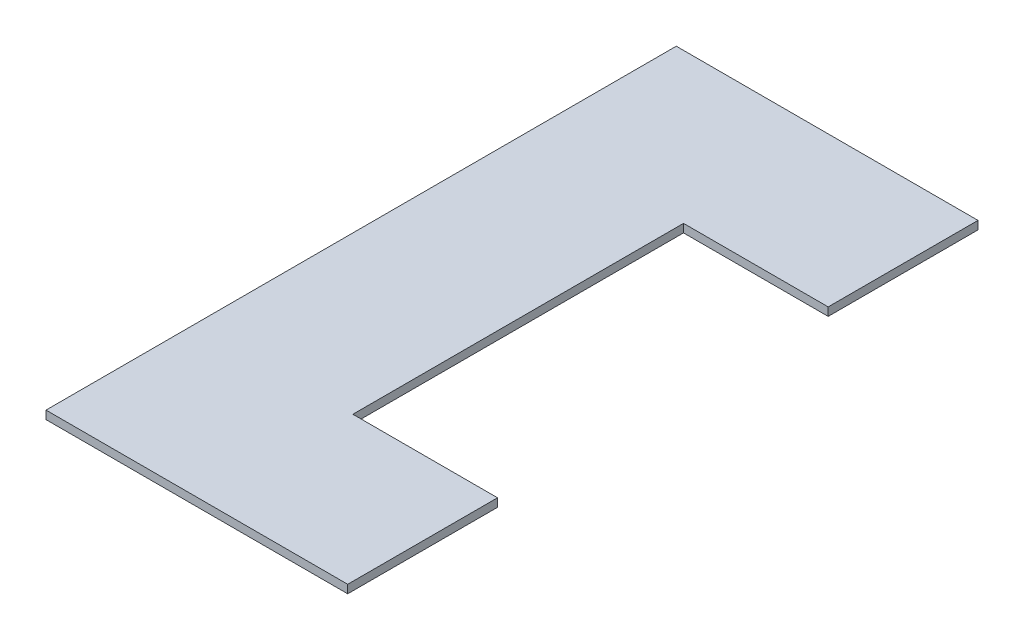
ISO-10303-21;
HEADER;
FILE_DESCRIPTION(('STEP AP214'),'2;1');
FILE_NAME('part.step','',(''),(''),'','','');
FILE_SCHEMA(('AUTOMOTIVE_DESIGN { 1 0 10303 214 1 1 1 1 }'));
ENDSEC;
DATA;
#1=APPLICATION_CONTEXT('core data for automotive mechanical design processes');
#2=APPLICATION_PROTOCOL_DEFINITION('international standard','automotive_design',2000,#1);
#3=PRODUCT_CONTEXT('',#1,'mechanical');
#4=PRODUCT('Part','Part','',(#3));
#5=PRODUCT_RELATED_PRODUCT_CATEGORY('part','',(#4));
#6=PRODUCT_DEFINITION_FORMATION('','',#4);
#7=PRODUCT_DEFINITION_CONTEXT('part definition',#1,'design');
#8=PRODUCT_DEFINITION('design','',#6,#7);
#9=PRODUCT_DEFINITION_SHAPE('','',#8);
#10=(LENGTH_UNIT() NAMED_UNIT(*) SI_UNIT(.MILLI.,.METRE.));
#11=(NAMED_UNIT(*) PLANE_ANGLE_UNIT() SI_UNIT($,.RADIAN.));
#12=(NAMED_UNIT(*) SI_UNIT($,.STERADIAN.) SOLID_ANGLE_UNIT());
#13=UNCERTAINTY_MEASURE_WITH_UNIT(LENGTH_MEASURE(1.E-05),#10,'distance_accuracy_value','');
#14=(GEOMETRIC_REPRESENTATION_CONTEXT(3) GLOBAL_UNCERTAINTY_ASSIGNED_CONTEXT((#13)) GLOBAL_UNIT_ASSIGNED_CONTEXT((#10,
#11,#12)) REPRESENTATION_CONTEXT('',''));
#15=CARTESIAN_POINT('',(0.,0.,0.));
#16=DIRECTION('',(0.,0.,1.));
#17=DIRECTION('',(1.,0.,0.));
#18=AXIS2_PLACEMENT_3D('',#15,#16,#17);
#19=CARTESIAN_POINT('',(-50.0000000000001,4.,0.));
#20=DIRECTION('',(-1.,0.,0.));
#21=DIRECTION('',(0.,0.,1.));
#22=AXIS2_PLACEMENT_3D('',#19,#20,#21);
#23=PLANE('',#22);
#24=DIRECTION('',(0.,0.,-1.));
#25=VECTOR('',#24,1.);
#26=CARTESIAN_POINT('',(-50.0000000000001,0.,0.));
#27=LINE('',#26,#25);
#28=CARTESIAN_POINT('',(-50.0000000000001,0.,152.5));
#29=VERTEX_POINT('',#28);
#30=CARTESIAN_POINT('',(-50.0000000000001,0.,80.));
#31=VERTEX_POINT('',#30);
#32=EDGE_CURVE('E131',#29,#31,#27,.T.);
#33=ORIENTED_EDGE('',*,*,#32,.T.);
#34=DIRECTION('',(0.,1.,0.));
#35=VECTOR('',#34,1.);
#36=CARTESIAN_POINT('',(-50.0000000000001,-6.,80.));
#37=LINE('',#36,#35);
#38=CARTESIAN_POINT('',(-50.0000000000001,4.,80.));
#39=VERTEX_POINT('',#38);
#40=EDGE_CURVE('E156',#31,#39,#37,.T.);
#41=ORIENTED_EDGE('',*,*,#40,.T.);
#42=DIRECTION('',(0.,0.,-1.));
#43=VECTOR('',#42,1.);
#44=CARTESIAN_POINT('',(-50.0000000000001,4.,0.));
#45=LINE('',#44,#43);
#46=CARTESIAN_POINT('',(-50.0000000000001,4.,152.5));
#47=VERTEX_POINT('',#46);
#48=EDGE_CURVE('E125',#47,#39,#45,.T.);
#49=ORIENTED_EDGE('',*,*,#48,.F.);
#50=DIRECTION('',(0.,1.,0.));
#51=VECTOR('',#50,1.);
#52=CARTESIAN_POINT('',(-50.0000000000001,-6.,152.5));
#53=LINE('',#52,#51);
#54=EDGE_CURVE('E169',#29,#47,#53,.T.);
#55=ORIENTED_EDGE('',*,*,#54,.F.);
#56=EDGE_LOOP('',(#33,#41,#49,#55));
#57=FACE_BOUND('',#56,.T.);
#58=ADVANCED_FACE('F41',(#57),#23,.F.);
#59=CARTESIAN_POINT('',(-50.0000000000001,4.,-80.));
#60=VERTEX_POINT('',#59);
#61=CARTESIAN_POINT('',(-50.0000000000001,4.,-152.5));
#62=VERTEX_POINT('',#61);
#63=EDGE_CURVE('E119',#60,#62,#45,.T.);
#64=ORIENTED_EDGE('',*,*,#63,.F.);
#65=DIRECTION('',(0.,1.,0.));
#66=VECTOR('',#65,1.);
#67=CARTESIAN_POINT('',(-50.0000000000001,-6.,-80.));
#68=LINE('',#67,#66);
#69=CARTESIAN_POINT('',(-50.0000000000001,0.,-80.));
#70=VERTEX_POINT('',#69);
#71=EDGE_CURVE('E105',#70,#60,#68,.T.);
#72=ORIENTED_EDGE('',*,*,#71,.F.);
#73=CARTESIAN_POINT('',(-50.0000000000001,0.,-152.5));
#74=VERTEX_POINT('',#73);
#75=EDGE_CURVE('E64',#70,#74,#27,.T.);
#76=ORIENTED_EDGE('',*,*,#75,.T.);
#77=DIRECTION('',(0.,1.,0.));
#78=VECTOR('',#77,1.);
#79=CARTESIAN_POINT('',(-50.0000000000001,-6.,-152.5));
#80=LINE('',#79,#78);
#81=EDGE_CURVE('E124',#74,#62,#80,.T.);
#82=ORIENTED_EDGE('',*,*,#81,.T.);
#83=EDGE_LOOP('',(#64,#72,#76,#82));
#84=FACE_BOUND('',#83,.T.);
#85=ADVANCED_FACE('F43',(#84),#23,.F.);
#86=CARTESIAN_POINT('',(-196.,4.,0.));
#87=DIRECTION('',(1.,0.,0.));
#88=DIRECTION('',(0.,0.,-1.));
#89=AXIS2_PLACEMENT_3D('',#86,#87,#88);
#90=PLANE('',#89);
#91=DIRECTION('',(0.,0.,1.));
#92=VECTOR('',#91,1.);
#93=CARTESIAN_POINT('',(-196.,4.,0.));
#94=LINE('',#93,#92);
#95=CARTESIAN_POINT('',(-196.,4.,-152.5));
#96=VERTEX_POINT('',#95);
#97=CARTESIAN_POINT('',(-196.,4.,152.5));
#98=VERTEX_POINT('',#97);
#99=EDGE_CURVE('E129',#96,#98,#94,.T.);
#100=ORIENTED_EDGE('',*,*,#99,.F.);
#101=DIRECTION('',(0.,1.,0.));
#102=VECTOR('',#101,1.);
#103=CARTESIAN_POINT('',(-196.,-6.,-152.5));
#104=LINE('',#103,#102);
#105=CARTESIAN_POINT('',(-196.,0.,-152.5));
#106=VERTEX_POINT('',#105);
#107=EDGE_CURVE('E166',#106,#96,#104,.T.);
#108=ORIENTED_EDGE('',*,*,#107,.F.);
#109=DIRECTION('',(0.,0.,1.));
#110=VECTOR('',#109,1.);
#111=CARTESIAN_POINT('',(-196.,0.,0.));
#112=LINE('',#111,#110);
#113=CARTESIAN_POINT('',(-196.,0.,152.5));
#114=VERTEX_POINT('',#113);
#115=EDGE_CURVE('E126',#106,#114,#112,.T.);
#116=ORIENTED_EDGE('',*,*,#115,.T.);
#117=DIRECTION('',(0.,1.,0.));
#118=VECTOR('',#117,1.);
#119=CARTESIAN_POINT('',(-196.,-6.,152.5));
#120=LINE('',#119,#118);
#121=EDGE_CURVE('E159',#114,#98,#120,.T.);
#122=ORIENTED_EDGE('',*,*,#121,.T.);
#123=EDGE_LOOP('',(#100,#108,#116,#122));
#124=FACE_BOUND('',#123,.T.);
#125=ADVANCED_FACE('F173',(#124),#90,.F.);
#126=CARTESIAN_POINT('',(0.,4.,0.));
#127=DIRECTION('',(0.,1.,0.));
#128=DIRECTION('',(0.,0.,1.));
#129=AXIS2_PLACEMENT_3D('',#126,#127,#128);
#130=PLANE('',#129);
#131=DIRECTION('',(1.,0.,0.));
#132=VECTOR('',#131,1.);
#133=CARTESIAN_POINT('',(-120.,4.,80.));
#134=LINE('',#133,#132);
#135=CARTESIAN_POINT('',(-120.,4.,80.));
#136=VERTEX_POINT('',#135);
#137=EDGE_CURVE('E113',#136,#39,#134,.T.);
#138=ORIENTED_EDGE('',*,*,#137,.F.);
#139=DIRECTION('',(0.,0.,1.));
#140=VECTOR('',#139,1.);
#141=CARTESIAN_POINT('',(-120.,4.,-80.));
#142=LINE('',#141,#140);
#143=CARTESIAN_POINT('',(-120.,4.,-80.));
#144=VERTEX_POINT('',#143);
#145=EDGE_CURVE('E122',#144,#136,#142,.T.);
#146=ORIENTED_EDGE('',*,*,#145,.F.);
#147=DIRECTION('',(-1.,0.,0.));
#148=VECTOR('',#147,1.);
#149=CARTESIAN_POINT('',(-120.,4.,-80.));
#150=LINE('',#149,#148);
#151=EDGE_CURVE('E108',#60,#144,#150,.T.);
#152=ORIENTED_EDGE('',*,*,#151,.F.);
#153=ORIENTED_EDGE('',*,*,#63,.T.);
#154=DIRECTION('',(1.,0.,0.));
#155=VECTOR('',#154,1.);
#156=CARTESIAN_POINT('',(-196.,4.,-152.5));
#157=LINE('',#156,#155);
#158=EDGE_CURVE('E164',#96,#62,#157,.T.);
#159=ORIENTED_EDGE('',*,*,#158,.F.);
#160=ORIENTED_EDGE('',*,*,#99,.T.);
#161=DIRECTION('',(-1.,0.,0.));
#162=VECTOR('',#161,1.);
#163=CARTESIAN_POINT('',(-196.,4.,152.5));
#164=LINE('',#163,#162);
#165=EDGE_CURVE('E135',#47,#98,#164,.T.);
#166=ORIENTED_EDGE('',*,*,#165,.F.);
#167=ORIENTED_EDGE('',*,*,#48,.T.);
#168=EDGE_LOOP('',(#138,#146,#152,#153,#159,#160,#166,#167));
#169=FACE_BOUND('',#168,.T.);
#170=ADVANCED_FACE('F117',(#169),#130,.T.);
#171=CARTESIAN_POINT('',(0.,0.,0.));
#172=DIRECTION('',(0.,1.,0.));
#173=DIRECTION('',(0.,0.,1.));
#174=AXIS2_PLACEMENT_3D('',#171,#172,#173);
#175=PLANE('',#174);
#176=DIRECTION('',(0.,0.,1.));
#177=VECTOR('',#176,1.);
#178=CARTESIAN_POINT('',(-120.,0.,0.));
#179=LINE('',#178,#177);
#180=CARTESIAN_POINT('',(-120.,0.,-80.));
#181=VERTEX_POINT('',#180);
#182=CARTESIAN_POINT('',(-120.,0.,80.));
#183=VERTEX_POINT('',#182);
#184=EDGE_CURVE('E49',#181,#183,#179,.T.);
#185=ORIENTED_EDGE('',*,*,#184,.T.);
#186=DIRECTION('',(1.,0.,0.));
#187=VECTOR('',#186,1.);
#188=CARTESIAN_POINT('',(0.,0.,80.));
#189=LINE('',#188,#187);
#190=EDGE_CURVE('E11',#183,#31,#189,.T.);
#191=ORIENTED_EDGE('',*,*,#190,.T.);
#192=ORIENTED_EDGE('',*,*,#32,.F.);
#193=DIRECTION('',(-1.,0.,0.));
#194=VECTOR('',#193,1.);
#195=CARTESIAN_POINT('',(0.,0.,152.5));
#196=LINE('',#195,#194);
#197=EDGE_CURVE('E139',#29,#114,#196,.T.);
#198=ORIENTED_EDGE('',*,*,#197,.T.);
#199=ORIENTED_EDGE('',*,*,#115,.F.);
#200=DIRECTION('',(1.,0.,0.));
#201=VECTOR('',#200,1.);
#202=CARTESIAN_POINT('',(0.,0.,-152.5));
#203=LINE('',#202,#201);
#204=EDGE_CURVE('E144',#106,#74,#203,.T.);
#205=ORIENTED_EDGE('',*,*,#204,.T.);
#206=ORIENTED_EDGE('',*,*,#75,.F.);
#207=DIRECTION('',(-1.,0.,0.));
#208=VECTOR('',#207,1.);
#209=CARTESIAN_POINT('',(0.,0.,-80.));
#210=LINE('',#209,#208);
#211=EDGE_CURVE('E111',#70,#181,#210,.T.);
#212=ORIENTED_EDGE('',*,*,#211,.T.);
#213=EDGE_LOOP('',(#185,#191,#192,#198,#199,#205,#206,#212));
#214=FACE_BOUND('',#213,.T.);
#215=ADVANCED_FACE('F149',(#214),#175,.F.);
#216=CARTESIAN_POINT('',(-196.,-6.,152.5));
#217=DIRECTION('',(0.,0.,-1.));
#218=DIRECTION('',(-1.,0.,0.));
#219=AXIS2_PLACEMENT_3D('',#216,#217,#218);
#220=PLANE('',#219);
#221=ORIENTED_EDGE('',*,*,#54,.T.);
#222=ORIENTED_EDGE('',*,*,#165,.T.);
#223=ORIENTED_EDGE('',*,*,#121,.F.);
#224=ORIENTED_EDGE('',*,*,#197,.F.);
#225=EDGE_LOOP('',(#221,#222,#223,#224));
#226=FACE_BOUND('',#225,.T.);
#227=ADVANCED_FACE('F182',(#226),#220,.F.);
#228=CARTESIAN_POINT('',(-196.,-6.,-152.5));
#229=DIRECTION('',(0.,0.,1.));
#230=DIRECTION('',(1.,0.,0.));
#231=AXIS2_PLACEMENT_3D('',#228,#229,#230);
#232=PLANE('',#231);
#233=ORIENTED_EDGE('',*,*,#107,.T.);
#234=ORIENTED_EDGE('',*,*,#158,.T.);
#235=ORIENTED_EDGE('',*,*,#81,.F.);
#236=ORIENTED_EDGE('',*,*,#204,.F.);
#237=EDGE_LOOP('',(#233,#234,#235,#236));
#238=FACE_BOUND('',#237,.T.);
#239=ADVANCED_FACE('F180',(#238),#232,.F.);
#240=CARTESIAN_POINT('',(-120.,-6.,80.));
#241=DIRECTION('',(0.,0.,1.));
#242=DIRECTION('',(1.,0.,0.));
#243=AXIS2_PLACEMENT_3D('',#240,#241,#242);
#244=PLANE('',#243);
#245=DIRECTION('',(0.,1.,0.));
#246=VECTOR('',#245,1.);
#247=CARTESIAN_POINT('',(-120.,-6.,80.));
#248=LINE('',#247,#246);
#249=EDGE_CURVE('E154',#183,#136,#248,.T.);
#250=ORIENTED_EDGE('',*,*,#249,.T.);
#251=ORIENTED_EDGE('',*,*,#137,.T.);
#252=ORIENTED_EDGE('',*,*,#40,.F.);
#253=ORIENTED_EDGE('',*,*,#190,.F.);
#254=EDGE_LOOP('',(#250,#251,#252,#253));
#255=FACE_BOUND('',#254,.T.);
#256=ADVANCED_FACE('F185',(#255),#244,.F.);
#257=CARTESIAN_POINT('',(-120.,-6.,-80.));
#258=DIRECTION('',(-1.,0.,0.));
#259=DIRECTION('',(0.,0.,1.));
#260=AXIS2_PLACEMENT_3D('',#257,#258,#259);
#261=PLANE('',#260);
#262=DIRECTION('',(0.,1.,0.));
#263=VECTOR('',#262,1.);
#264=CARTESIAN_POINT('',(-120.,-6.,-80.));
#265=LINE('',#264,#263);
#266=EDGE_CURVE('E56',#181,#144,#265,.T.);
#267=ORIENTED_EDGE('',*,*,#266,.T.);
#268=ORIENTED_EDGE('',*,*,#145,.T.);
#269=ORIENTED_EDGE('',*,*,#249,.F.);
#270=ORIENTED_EDGE('',*,*,#184,.F.);
#271=EDGE_LOOP('',(#267,#268,#269,#270));
#272=FACE_BOUND('',#271,.T.);
#273=ADVANCED_FACE('F153',(#272),#261,.F.);
#274=CARTESIAN_POINT('',(-120.,-6.,-80.));
#275=DIRECTION('',(0.,0.,-1.));
#276=DIRECTION('',(-1.,0.,0.));
#277=AXIS2_PLACEMENT_3D('',#274,#275,#276);
#278=PLANE('',#277);
#279=ORIENTED_EDGE('',*,*,#71,.T.);
#280=ORIENTED_EDGE('',*,*,#151,.T.);
#281=ORIENTED_EDGE('',*,*,#266,.F.);
#282=ORIENTED_EDGE('',*,*,#211,.F.);
#283=EDGE_LOOP('',(#279,#280,#281,#282));
#284=FACE_BOUND('',#283,.T.);
#285=ADVANCED_FACE('F107',(#284),#278,.F.);
#286=CLOSED_SHELL('',(#58,#85,#125,#170,#215,#227,#239,#256,#273,#285));
#287=MANIFOLD_SOLID_BREP('B2',#286);
#288=ADVANCED_BREP_SHAPE_REPRESENTATION('',(#18,#287),#14);
#289=SHAPE_DEFINITION_REPRESENTATION(#9,#288);
ENDSEC;
END-ISO-10303-21;
